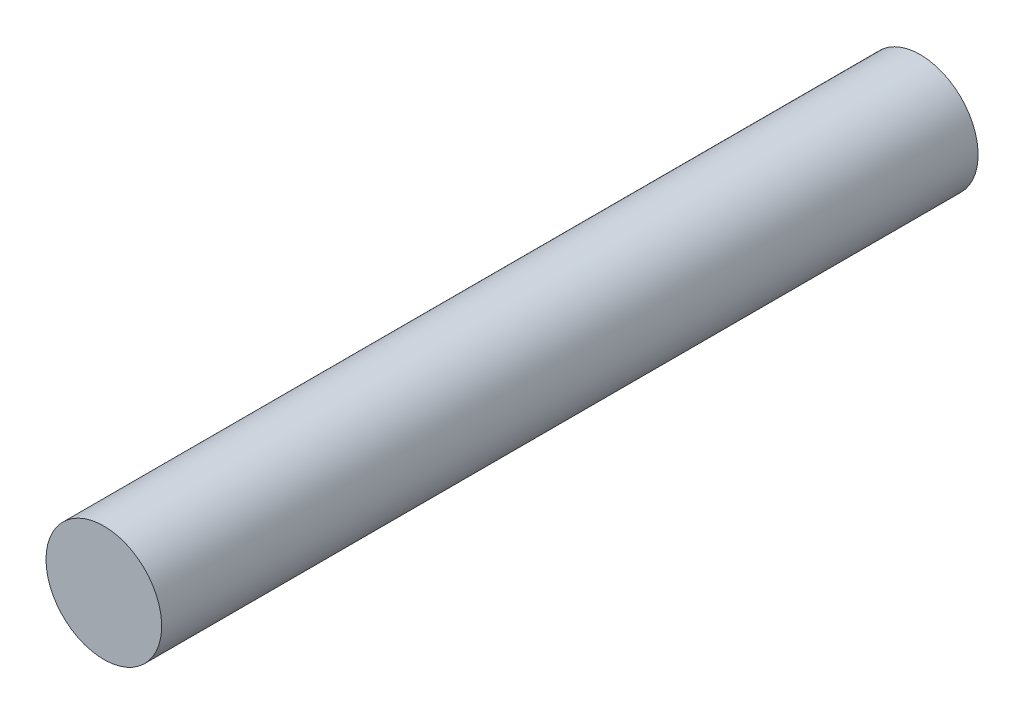
ISO-10303-21;
HEADER;
FILE_DESCRIPTION(('STEP AP214'),'2;1');
FILE_NAME('part.step','',(''),(''),'','','');
FILE_SCHEMA(('AUTOMOTIVE_DESIGN { 1 0 10303 214 1 1 1 1 }'));
ENDSEC;
DATA;
#1=APPLICATION_CONTEXT('core data for automotive mechanical design processes');
#2=APPLICATION_PROTOCOL_DEFINITION('international standard','automotive_design',2000,#1);
#3=PRODUCT_CONTEXT('',#1,'mechanical');
#4=PRODUCT('Part','Part','',(#3));
#5=PRODUCT_RELATED_PRODUCT_CATEGORY('part','',(#4));
#6=PRODUCT_DEFINITION_FORMATION('','',#4);
#7=PRODUCT_DEFINITION_CONTEXT('part definition',#1,'design');
#8=PRODUCT_DEFINITION('design','',#6,#7);
#9=PRODUCT_DEFINITION_SHAPE('','',#8);
#10=(LENGTH_UNIT() NAMED_UNIT(*) SI_UNIT(.MILLI.,.METRE.));
#11=(NAMED_UNIT(*) PLANE_ANGLE_UNIT() SI_UNIT($,.RADIAN.));
#12=(NAMED_UNIT(*) SI_UNIT($,.STERADIAN.) SOLID_ANGLE_UNIT());
#13=UNCERTAINTY_MEASURE_WITH_UNIT(LENGTH_MEASURE(1.E-05),#10,'distance_accuracy_value','');
#14=(GEOMETRIC_REPRESENTATION_CONTEXT(3) GLOBAL_UNCERTAINTY_ASSIGNED_CONTEXT((#13)) GLOBAL_UNIT_ASSIGNED_CONTEXT((#10,
#11,#12)) REPRESENTATION_CONTEXT('',''));
#15=CARTESIAN_POINT('',(0.,0.,0.));
#16=DIRECTION('',(0.,0.,1.));
#17=DIRECTION('',(1.,0.,0.));
#18=AXIS2_PLACEMENT_3D('',#15,#16,#17);
#19=CARTESIAN_POINT('',(0.,0.,60.));
#20=DIRECTION('',(0.,0.,-1.));
#21=DIRECTION('',(-1.,0.,0.));
#22=AXIS2_PLACEMENT_3D('',#19,#20,#21);
#23=CYLINDRICAL_SURFACE('',#22,4.25);
#24=CARTESIAN_POINT('',(0.,0.,60.));
#25=DIRECTION('',(0.,0.,1.));
#26=DIRECTION('',(1.,0.,0.));
#27=AXIS2_PLACEMENT_3D('',#24,#25,#26);
#28=CIRCLE('',#27,4.25);
#29=CARTESIAN_POINT('',(-4.25,0.,60.));
#30=VERTEX_POINT('',#29);
#31=EDGE_CURVE('E65',#30,#30,#28,.T.);
#32=CARTESIAN_POINT('',(0.,0.,0.));
#33=DIRECTION('',(0.,0.,1.));
#34=DIRECTION('',(1.,0.,0.));
#35=AXIS2_PLACEMENT_3D('',#32,#33,#34);
#36=CIRCLE('',#35,4.25);
#37=CARTESIAN_POINT('',(-4.25,0.,0.));
#38=VERTEX_POINT('',#37);
#39=EDGE_CURVE('E66',#38,#38,#36,.T.);
#40=CARTESIAN_POINT('',(-4.25,0.,60.));
#41=CARTESIAN_POINT('',(-4.25,0.,59.375));
#42=CARTESIAN_POINT('',(-4.25,0.,58.75));
#43=CARTESIAN_POINT('',(-4.25,0.,57.5));
#44=CARTESIAN_POINT('',(-4.25,0.,56.875));
#45=CARTESIAN_POINT('',(-4.25,0.,55.625));
#46=CARTESIAN_POINT('',(-4.25,0.,55.));
#47=CARTESIAN_POINT('',(-4.25,0.,53.75));
#48=CARTESIAN_POINT('',(-4.25,0.,53.125));
#49=CARTESIAN_POINT('',(-4.25,0.,51.875));
#50=CARTESIAN_POINT('',(-4.25,0.,51.25));
#51=CARTESIAN_POINT('',(-4.25,0.,50.));
#52=CARTESIAN_POINT('',(-4.25,0.,49.375));
#53=CARTESIAN_POINT('',(-4.25,0.,48.125));
#54=CARTESIAN_POINT('',(-4.25,0.,47.5));
#55=CARTESIAN_POINT('',(-4.25,0.,46.25));
#56=CARTESIAN_POINT('',(-4.25,0.,45.625));
#57=CARTESIAN_POINT('',(-4.25,0.,44.375));
#58=CARTESIAN_POINT('',(-4.25,0.,43.75));
#59=CARTESIAN_POINT('',(-4.25,0.,42.5));
#60=CARTESIAN_POINT('',(-4.25,0.,41.875));
#61=CARTESIAN_POINT('',(-4.25,0.,40.625));
#62=CARTESIAN_POINT('',(-4.25,0.,40.));
#63=CARTESIAN_POINT('',(-4.25,0.,38.75));
#64=CARTESIAN_POINT('',(-4.25,0.,38.125));
#65=CARTESIAN_POINT('',(-4.25,0.,36.875));
#66=CARTESIAN_POINT('',(-4.25,0.,36.25));
#67=CARTESIAN_POINT('',(-4.25,0.,35.));
#68=CARTESIAN_POINT('',(-4.25,0.,34.375));
#69=CARTESIAN_POINT('',(-4.25,0.,33.125));
#70=CARTESIAN_POINT('',(-4.25,0.,32.5));
#71=CARTESIAN_POINT('',(-4.25,0.,31.25));
#72=CARTESIAN_POINT('',(-4.25,0.,30.625));
#73=CARTESIAN_POINT('',(-4.25,0.,29.375));
#74=CARTESIAN_POINT('',(-4.25,0.,28.75));
#75=CARTESIAN_POINT('',(-4.25,0.,27.5));
#76=CARTESIAN_POINT('',(-4.25,0.,26.875));
#77=CARTESIAN_POINT('',(-4.25,0.,25.625));
#78=CARTESIAN_POINT('',(-4.25,0.,25.));
#79=CARTESIAN_POINT('',(-4.25,0.,23.75));
#80=CARTESIAN_POINT('',(-4.25,0.,23.125));
#81=CARTESIAN_POINT('',(-4.25,0.,21.875));
#82=CARTESIAN_POINT('',(-4.25,0.,21.25));
#83=CARTESIAN_POINT('',(-4.25,0.,20.));
#84=CARTESIAN_POINT('',(-4.25,0.,19.375));
#85=CARTESIAN_POINT('',(-4.25,0.,18.125));
#86=CARTESIAN_POINT('',(-4.25,0.,17.5));
#87=CARTESIAN_POINT('',(-4.25,0.,16.25));
#88=CARTESIAN_POINT('',(-4.25,0.,15.625));
#89=CARTESIAN_POINT('',(-4.25,0.,14.375));
#90=CARTESIAN_POINT('',(-4.25,0.,13.75));
#91=CARTESIAN_POINT('',(-4.25,0.,12.5));
#92=CARTESIAN_POINT('',(-4.25,0.,11.875));
#93=CARTESIAN_POINT('',(-4.25,0.,10.625));
#94=CARTESIAN_POINT('',(-4.25,0.,10.));
#95=CARTESIAN_POINT('',(-4.25,0.,8.75));
#96=CARTESIAN_POINT('',(-4.25,0.,8.125));
#97=CARTESIAN_POINT('',(-4.25,0.,6.875));
#98=CARTESIAN_POINT('',(-4.25,0.,6.25));
#99=CARTESIAN_POINT('',(-4.25,0.,5.));
#100=CARTESIAN_POINT('',(-4.25,0.,4.375));
#101=CARTESIAN_POINT('',(-4.25,0.,3.125));
#102=CARTESIAN_POINT('',(-4.25,0.,2.5));
#103=CARTESIAN_POINT('',(-4.25,0.,1.25));
#104=CARTESIAN_POINT('',(-4.25,0.,0.625000000000001));
#105=CARTESIAN_POINT('',(-4.25,0.,0.));
#106=B_SPLINE_CURVE_WITH_KNOTS('',3,(#40,#41,#42,#43,#44,#45,#46,#47,#48,#49,#50,#51,#52,#53,
#54,#55,#56,#57,#58,#59,#60,#61,#62,#63,#64,#65,#66,#67,#68,#69,#70,#71,#72,#73,#74,#75,#76,#77,
#78,#79,#80,#81,#82,#83,#84,#85,#86,#87,#88,#89,#90,#91,#92,#93,#94,#95,#96,#97,#98,#99,#100,
#101,#102,#103,#104,#105),.UNSPECIFIED.,.F.,.F.,(4,2,2,2,2,2,2,2,2,2,2,2,2,2,2,2,2,2,2,2,2,2,2,
2,2,2,2,2,2,2,2,2,4),(0.,1.87499999999999,3.75,5.625,7.49999999999999,9.37499999999999,11.25,
13.125,15.,16.875,18.75,20.625,22.5,24.375,26.25,28.125,30.,31.875,33.75,35.625,37.5,39.375,
41.25,43.125,45.,46.875,48.75,50.625,52.5,54.375,56.25,58.125,60.),.UNSPECIFIED.);
#107=EDGE_CURVE('BSEAM34',#30,#38,#106,.T.);
#108=ORIENTED_EDGE('',*,*,#31,.F.);
#109=ORIENTED_EDGE('',*,*,#39,.T.);
#110=ORIENTED_EDGE('',*,*,#107,.T.);
#111=ORIENTED_EDGE('',*,*,#107,.F.);
#112=EDGE_LOOP('',(#108,#110,#109,#111));
#113=FACE_BOUND('',#112,.T.);
#114=ADVANCED_FACE('F34',(#113),#23,.T.);
#115=CARTESIAN_POINT('',(0.,0.,60.));
#116=DIRECTION('',(0.,0.,1.));
#117=DIRECTION('',(1.,0.,0.));
#118=AXIS2_PLACEMENT_3D('',#115,#116,#117);
#119=PLANE('',#118);
#120=ORIENTED_EDGE('',*,*,#31,.T.);
#121=EDGE_LOOP('',(#120));
#122=FACE_BOUND('',#121,.T.);
#123=ADVANCED_FACE('F111',(#122),#119,.T.);
#124=CARTESIAN_POINT('',(0.,0.,0.));
#125=DIRECTION('',(0.,0.,1.));
#126=DIRECTION('',(1.,0.,0.));
#127=AXIS2_PLACEMENT_3D('',#124,#125,#126);
#128=PLANE('',#127);
#129=CARTESIAN_POINT('',(2.99999999999999,1.00000000000003,0.));
#130=DIRECTION('',(0.,0.,1.));
#131=DIRECTION('',(1.,0.,0.));
#132=AXIS2_PLACEMENT_3D('',#129,#130,#131);
#133=CIRCLE('',#132,0.5);
#134=CARTESIAN_POINT('',(3.49999999999999,1.00000000000003,0.));
#135=VERTEX_POINT('',#134);
#136=EDGE_CURVE('E10',#135,#135,#133,.F.);
#137=ORIENTED_EDGE('',*,*,#136,.F.);
#138=EDGE_LOOP('',(#137));
#139=FACE_BOUND('',#138,.T.);
#140=CARTESIAN_POINT('',(3.00000000000001,-0.999999999999969,0.));
#141=DIRECTION('',(0.,0.,1.));
#142=DIRECTION('',(1.,0.,0.));
#143=AXIS2_PLACEMENT_3D('',#140,#141,#142);
#144=CIRCLE('',#143,0.5);
#145=CARTESIAN_POINT('',(3.50000000000001,-0.999999999999969,0.));
#146=VERTEX_POINT('',#145);
#147=EDGE_CURVE('E40',#146,#146,#144,.F.);
#148=ORIENTED_EDGE('',*,*,#147,.F.);
#149=EDGE_LOOP('',(#148));
#150=FACE_BOUND('',#149,.T.);
#151=CARTESIAN_POINT('',(1.,-3.,0.));
#152=DIRECTION('',(0.,0.,1.));
#153=DIRECTION('',(1.,0.,0.));
#154=AXIS2_PLACEMENT_3D('',#151,#152,#153);
#155=CIRCLE('',#154,0.5);
#156=CARTESIAN_POINT('',(1.5,-3.,0.));
#157=VERTEX_POINT('',#156);
#158=EDGE_CURVE('E44',#157,#157,#155,.F.);
#159=ORIENTED_EDGE('',*,*,#158,.F.);
#160=EDGE_LOOP('',(#159));
#161=FACE_BOUND('',#160,.T.);
#162=CARTESIAN_POINT('',(-1.,-3.,0.));
#163=DIRECTION('',(0.,0.,1.));
#164=DIRECTION('',(1.,0.,0.));
#165=AXIS2_PLACEMENT_3D('',#162,#163,#164);
#166=CIRCLE('',#165,0.5);
#167=CARTESIAN_POINT('',(-0.5,-3.,0.));
#168=VERTEX_POINT('',#167);
#169=EDGE_CURVE('E48',#168,#168,#166,.F.);
#170=ORIENTED_EDGE('',*,*,#169,.F.);
#171=EDGE_LOOP('',(#170));
#172=FACE_BOUND('',#171,.T.);
#173=CARTESIAN_POINT('',(-3.,-1.00000000000001,0.));
#174=DIRECTION('',(0.,0.,1.));
#175=DIRECTION('',(1.,0.,0.));
#176=AXIS2_PLACEMENT_3D('',#173,#174,#175);
#177=CIRCLE('',#176,0.5);
#178=CARTESIAN_POINT('',(-2.5,-1.00000000000001,0.));
#179=VERTEX_POINT('',#178);
#180=EDGE_CURVE('E53',#179,#179,#177,.F.);
#181=ORIENTED_EDGE('',*,*,#180,.F.);
#182=EDGE_LOOP('',(#181));
#183=FACE_BOUND('',#182,.T.);
#184=CARTESIAN_POINT('',(-3.,0.99999999999999,0.));
#185=DIRECTION('',(0.,0.,1.));
#186=DIRECTION('',(1.,0.,0.));
#187=AXIS2_PLACEMENT_3D('',#184,#185,#186);
#188=CIRCLE('',#187,0.5);
#189=CARTESIAN_POINT('',(-2.5,0.99999999999999,0.));
#190=VERTEX_POINT('',#189);
#191=EDGE_CURVE('E56',#190,#190,#188,.F.);
#192=ORIENTED_EDGE('',*,*,#191,.F.);
#193=EDGE_LOOP('',(#192));
#194=FACE_BOUND('',#193,.T.);
#195=CARTESIAN_POINT('',(-1.,3.,0.));
#196=DIRECTION('',(0.,0.,1.));
#197=DIRECTION('',(1.,0.,0.));
#198=AXIS2_PLACEMENT_3D('',#195,#196,#197);
#199=CIRCLE('',#198,0.5);
#200=CARTESIAN_POINT('',(-0.5,3.,0.));
#201=VERTEX_POINT('',#200);
#202=EDGE_CURVE('E59',#201,#201,#199,.F.);
#203=ORIENTED_EDGE('',*,*,#202,.F.);
#204=EDGE_LOOP('',(#203));
#205=FACE_BOUND('',#204,.T.);
#206=CARTESIAN_POINT('',(1.,3.,0.));
#207=DIRECTION('',(0.,0.,1.));
#208=DIRECTION('',(1.,0.,0.));
#209=AXIS2_PLACEMENT_3D('',#206,#207,#208);
#210=CIRCLE('',#209,0.5);
#211=CARTESIAN_POINT('',(1.5,3.,0.));
#212=VERTEX_POINT('',#211);
#213=EDGE_CURVE('E62',#212,#212,#210,.F.);
#214=ORIENTED_EDGE('',*,*,#213,.F.);
#215=EDGE_LOOP('',(#214));
#216=FACE_BOUND('',#215,.T.);
#217=ORIENTED_EDGE('',*,*,#39,.F.);
#218=EDGE_LOOP('',(#217));
#219=FACE_BOUND('',#218,.T.);
#220=ADVANCED_FACE('F116',(#139,#150,#161,#172,#183,#194,#205,#216,#219),#128,.F.);
#221=CARTESIAN_POINT('',(1.,3.,-0.1));
#222=DIRECTION('',(0.,0.,1.));
#223=DIRECTION('',(1.,0.,0.));
#224=AXIS2_PLACEMENT_3D('',#221,#222,#223);
#225=CYLINDRICAL_SURFACE('',#224,0.5);
#226=CARTESIAN_POINT('',(1.,3.,-0.1));
#227=DIRECTION('',(0.,0.,-1.));
#228=DIRECTION('',(-1.,0.,0.));
#229=AXIS2_PLACEMENT_3D('',#226,#227,#228);
#230=CIRCLE('',#229,0.5);
#231=CARTESIAN_POINT('',(0.5,3.,-0.1));
#232=VERTEX_POINT('',#231);
#233=EDGE_CURVE('E69',#232,#232,#230,.T.);
#234=ORIENTED_EDGE('',*,*,#233,.F.);
#235=EDGE_LOOP('',(#234));
#236=FACE_BOUND('',#235,.T.);
#237=ORIENTED_EDGE('',*,*,#213,.T.);
#238=EDGE_LOOP('',(#237));
#239=FACE_BOUND('',#238,.T.);
#240=ADVANCED_FACE('F124',(#236,#239),#225,.T.);
#241=CARTESIAN_POINT('',(0.,0.,-0.1));
#242=DIRECTION('',(0.,0.,-1.));
#243=DIRECTION('',(-1.,0.,0.));
#244=AXIS2_PLACEMENT_3D('',#241,#242,#243);
#245=PLANE('',#244);
#246=ORIENTED_EDGE('',*,*,#233,.T.);
#247=EDGE_LOOP('',(#246));
#248=FACE_BOUND('',#247,.T.);
#249=ADVANCED_FACE('F129',(#248),#245,.T.);
#250=CARTESIAN_POINT('',(-1.,3.,-0.1));
#251=DIRECTION('',(0.,0.,1.));
#252=DIRECTION('',(1.,0.,0.));
#253=AXIS2_PLACEMENT_3D('',#250,#251,#252);
#254=CYLINDRICAL_SURFACE('',#253,0.5);
#255=CARTESIAN_POINT('',(-1.,3.,-0.1));
#256=DIRECTION('',(0.,0.,-1.));
#257=DIRECTION('',(-1.,0.,0.));
#258=AXIS2_PLACEMENT_3D('',#255,#256,#257);
#259=CIRCLE('',#258,0.5);
#260=CARTESIAN_POINT('',(-1.5,3.,-0.1));
#261=VERTEX_POINT('',#260);
#262=EDGE_CURVE('E74',#261,#261,#259,.T.);
#263=ORIENTED_EDGE('',*,*,#262,.F.);
#264=EDGE_LOOP('',(#263));
#265=FACE_BOUND('',#264,.T.);
#266=ORIENTED_EDGE('',*,*,#202,.T.);
#267=EDGE_LOOP('',(#266));
#268=FACE_BOUND('',#267,.T.);
#269=ADVANCED_FACE('F136',(#265,#268),#254,.T.);
#270=CARTESIAN_POINT('',(0.,0.,-0.1));
#271=DIRECTION('',(0.,0.,-1.));
#272=DIRECTION('',(-1.,0.,0.));
#273=AXIS2_PLACEMENT_3D('',#270,#271,#272);
#274=PLANE('',#273);
#275=ORIENTED_EDGE('',*,*,#262,.T.);
#276=EDGE_LOOP('',(#275));
#277=FACE_BOUND('',#276,.T.);
#278=ADVANCED_FACE('F140',(#277),#274,.T.);
#279=CARTESIAN_POINT('',(-3.,0.99999999999999,-0.1));
#280=DIRECTION('',(0.,0.,1.));
#281=DIRECTION('',(1.,0.,0.));
#282=AXIS2_PLACEMENT_3D('',#279,#280,#281);
#283=CYLINDRICAL_SURFACE('',#282,0.5);
#284=CARTESIAN_POINT('',(-3.,0.99999999999999,-0.1));
#285=DIRECTION('',(0.,0.,-1.));
#286=DIRECTION('',(0.,-1.,0.));
#287=AXIS2_PLACEMENT_3D('',#284,#285,#286);
#288=CIRCLE('',#287,0.5);
#289=CARTESIAN_POINT('',(-3.,0.49999999999999,-0.1));
#290=VERTEX_POINT('',#289);
#291=EDGE_CURVE('E77',#290,#290,#288,.T.);
#292=ORIENTED_EDGE('',*,*,#291,.F.);
#293=EDGE_LOOP('',(#292));
#294=FACE_BOUND('',#293,.T.);
#295=ORIENTED_EDGE('',*,*,#191,.T.);
#296=EDGE_LOOP('',(#295));
#297=FACE_BOUND('',#296,.T.);
#298=ADVANCED_FACE('F144',(#294,#297),#283,.T.);
#299=CARTESIAN_POINT('',(0.,0.,-0.1));
#300=DIRECTION('',(0.,0.,-1.));
#301=DIRECTION('',(0.,-1.,0.));
#302=AXIS2_PLACEMENT_3D('',#299,#300,#301);
#303=PLANE('',#302);
#304=ORIENTED_EDGE('',*,*,#291,.T.);
#305=EDGE_LOOP('',(#304));
#306=FACE_BOUND('',#305,.T.);
#307=ADVANCED_FACE('F148',(#306),#303,.T.);
#308=CARTESIAN_POINT('',(-3.,-1.00000000000001,-0.1));
#309=DIRECTION('',(0.,0.,1.));
#310=DIRECTION('',(1.,0.,0.));
#311=AXIS2_PLACEMENT_3D('',#308,#309,#310);
#312=CYLINDRICAL_SURFACE('',#311,0.5);
#313=CARTESIAN_POINT('',(-3.,-1.00000000000001,-0.1));
#314=DIRECTION('',(0.,0.,-1.));
#315=DIRECTION('',(0.,-1.,0.));
#316=AXIS2_PLACEMENT_3D('',#313,#314,#315);
#317=CIRCLE('',#316,0.5);
#318=CARTESIAN_POINT('',(-3.,-1.50000000000001,-0.1));
#319=VERTEX_POINT('',#318);
#320=EDGE_CURVE('E80',#319,#319,#317,.T.);
#321=ORIENTED_EDGE('',*,*,#320,.F.);
#322=EDGE_LOOP('',(#321));
#323=FACE_BOUND('',#322,.T.);
#324=ORIENTED_EDGE('',*,*,#180,.T.);
#325=EDGE_LOOP('',(#324));
#326=FACE_BOUND('',#325,.T.);
#327=ADVANCED_FACE('F152',(#323,#326),#312,.T.);
#328=CARTESIAN_POINT('',(0.,0.,-0.1));
#329=DIRECTION('',(0.,0.,-1.));
#330=DIRECTION('',(0.,-1.,0.));
#331=AXIS2_PLACEMENT_3D('',#328,#329,#330);
#332=PLANE('',#331);
#333=ORIENTED_EDGE('',*,*,#320,.T.);
#334=EDGE_LOOP('',(#333));
#335=FACE_BOUND('',#334,.T.);
#336=ADVANCED_FACE('F156',(#335),#332,.T.);
#337=CARTESIAN_POINT('',(-1.,-3.,-0.1));
#338=DIRECTION('',(0.,0.,1.));
#339=DIRECTION('',(1.,0.,0.));
#340=AXIS2_PLACEMENT_3D('',#337,#338,#339);
#341=CYLINDRICAL_SURFACE('',#340,0.5);
#342=CARTESIAN_POINT('',(-1.,-3.,-0.1));
#343=DIRECTION('',(0.,0.,-1.));
#344=DIRECTION('',(1.,0.,0.));
#345=AXIS2_PLACEMENT_3D('',#342,#343,#344);
#346=CIRCLE('',#345,0.5);
#347=CARTESIAN_POINT('',(-0.5,-3.,-0.1));
#348=VERTEX_POINT('',#347);
#349=EDGE_CURVE('E83',#348,#348,#346,.T.);
#350=ORIENTED_EDGE('',*,*,#349,.F.);
#351=EDGE_LOOP('',(#350));
#352=FACE_BOUND('',#351,.T.);
#353=ORIENTED_EDGE('',*,*,#169,.T.);
#354=EDGE_LOOP('',(#353));
#355=FACE_BOUND('',#354,.T.);
#356=ADVANCED_FACE('F160',(#352,#355),#341,.T.);
#357=CARTESIAN_POINT('',(0.,0.,-0.1));
#358=DIRECTION('',(0.,0.,-1.));
#359=DIRECTION('',(1.,0.,0.));
#360=AXIS2_PLACEMENT_3D('',#357,#358,#359);
#361=PLANE('',#360);
#362=ORIENTED_EDGE('',*,*,#349,.T.);
#363=EDGE_LOOP('',(#362));
#364=FACE_BOUND('',#363,.T.);
#365=ADVANCED_FACE('F164',(#364),#361,.T.);
#366=CARTESIAN_POINT('',(1.,-3.,-0.1));
#367=DIRECTION('',(0.,0.,1.));
#368=DIRECTION('',(1.,0.,0.));
#369=AXIS2_PLACEMENT_3D('',#366,#367,#368);
#370=CYLINDRICAL_SURFACE('',#369,0.5);
#371=CARTESIAN_POINT('',(1.,-3.,-0.1));
#372=DIRECTION('',(0.,0.,-1.));
#373=DIRECTION('',(1.,0.,0.));
#374=AXIS2_PLACEMENT_3D('',#371,#372,#373);
#375=CIRCLE('',#374,0.5);
#376=CARTESIAN_POINT('',(1.5,-3.,-0.1));
#377=VERTEX_POINT('',#376);
#378=EDGE_CURVE('E86',#377,#377,#375,.T.);
#379=ORIENTED_EDGE('',*,*,#378,.F.);
#380=EDGE_LOOP('',(#379));
#381=FACE_BOUND('',#380,.T.);
#382=ORIENTED_EDGE('',*,*,#158,.T.);
#383=EDGE_LOOP('',(#382));
#384=FACE_BOUND('',#383,.T.);
#385=ADVANCED_FACE('F168',(#381,#384),#370,.T.);
#386=CARTESIAN_POINT('',(0.,0.,-0.1));
#387=DIRECTION('',(0.,0.,-1.));
#388=DIRECTION('',(1.,0.,0.));
#389=AXIS2_PLACEMENT_3D('',#386,#387,#388);
#390=PLANE('',#389);
#391=ORIENTED_EDGE('',*,*,#378,.T.);
#392=EDGE_LOOP('',(#391));
#393=FACE_BOUND('',#392,.T.);
#394=ADVANCED_FACE('F172',(#393),#390,.T.);
#395=CARTESIAN_POINT('',(3.00000000000001,-0.999999999999969,-0.1));
#396=DIRECTION('',(0.,0.,1.));
#397=DIRECTION('',(1.,0.,0.));
#398=AXIS2_PLACEMENT_3D('',#395,#396,#397);
#399=CYLINDRICAL_SURFACE('',#398,0.5);
#400=CARTESIAN_POINT('',(3.00000000000001,-0.999999999999969,-0.1));
#401=DIRECTION('',(0.,0.,-1.));
#402=DIRECTION('',(0.,1.,0.));
#403=AXIS2_PLACEMENT_3D('',#400,#401,#402);
#404=CIRCLE('',#403,0.5);
#405=CARTESIAN_POINT('',(3.00000000000001,-0.499999999999969,-0.1));
#406=VERTEX_POINT('',#405);
#407=EDGE_CURVE('E89',#406,#406,#404,.T.);
#408=ORIENTED_EDGE('',*,*,#407,.F.);
#409=EDGE_LOOP('',(#408));
#410=FACE_BOUND('',#409,.T.);
#411=ORIENTED_EDGE('',*,*,#147,.T.);
#412=EDGE_LOOP('',(#411));
#413=FACE_BOUND('',#412,.T.);
#414=ADVANCED_FACE('F107',(#410,#413),#399,.T.);
#415=CARTESIAN_POINT('',(0.,0.,-0.1));
#416=DIRECTION('',(0.,0.,-1.));
#417=DIRECTION('',(0.,1.,0.));
#418=AXIS2_PLACEMENT_3D('',#415,#416,#417);
#419=PLANE('',#418);
#420=ORIENTED_EDGE('',*,*,#407,.T.);
#421=EDGE_LOOP('',(#420));
#422=FACE_BOUND('',#421,.T.);
#423=ADVANCED_FACE('F100',(#422),#419,.T.);
#424=CARTESIAN_POINT('',(2.99999999999999,1.00000000000003,-0.1));
#425=DIRECTION('',(0.,0.,1.));
#426=DIRECTION('',(1.,0.,0.));
#427=AXIS2_PLACEMENT_3D('',#424,#425,#426);
#428=CYLINDRICAL_SURFACE('',#427,0.5);
#429=CARTESIAN_POINT('',(2.99999999999999,1.00000000000003,-0.1));
#430=DIRECTION('',(0.,0.,-1.));
#431=DIRECTION('',(0.,1.,0.));
#432=AXIS2_PLACEMENT_3D('',#429,#430,#431);
#433=CIRCLE('',#432,0.5);
#434=CARTESIAN_POINT('',(2.99999999999998,1.50000000000003,-0.1));
#435=VERTEX_POINT('',#434);
#436=EDGE_CURVE('E92',#435,#435,#433,.T.);
#437=ORIENTED_EDGE('',*,*,#436,.F.);
#438=EDGE_LOOP('',(#437));
#439=FACE_BOUND('',#438,.T.);
#440=ORIENTED_EDGE('',*,*,#136,.T.);
#441=EDGE_LOOP('',(#440));
#442=FACE_BOUND('',#441,.T.);
#443=ADVANCED_FACE('F98',(#439,#442),#428,.T.);
#444=CARTESIAN_POINT('',(0.,0.,-0.1));
#445=DIRECTION('',(0.,0.,-1.));
#446=DIRECTION('',(0.,1.,0.));
#447=AXIS2_PLACEMENT_3D('',#444,#445,#446);
#448=PLANE('',#447);
#449=ORIENTED_EDGE('',*,*,#436,.T.);
#450=EDGE_LOOP('',(#449));
#451=FACE_BOUND('',#450,.T.);
#452=ADVANCED_FACE('F96',(#451),#448,.T.);
#453=CLOSED_SHELL('',(#114,#123,#220,#240,#249,#269,#278,#298,#307,#327,#336,#356,#365,#385,
#394,#414,#423,#443,#452));
#454=MANIFOLD_SOLID_BREP('B2',#453);
#455=ADVANCED_BREP_SHAPE_REPRESENTATION('',(#18,#454),#14);
#456=SHAPE_DEFINITION_REPRESENTATION(#9,#455);
ENDSEC;
END-ISO-10303-21;
